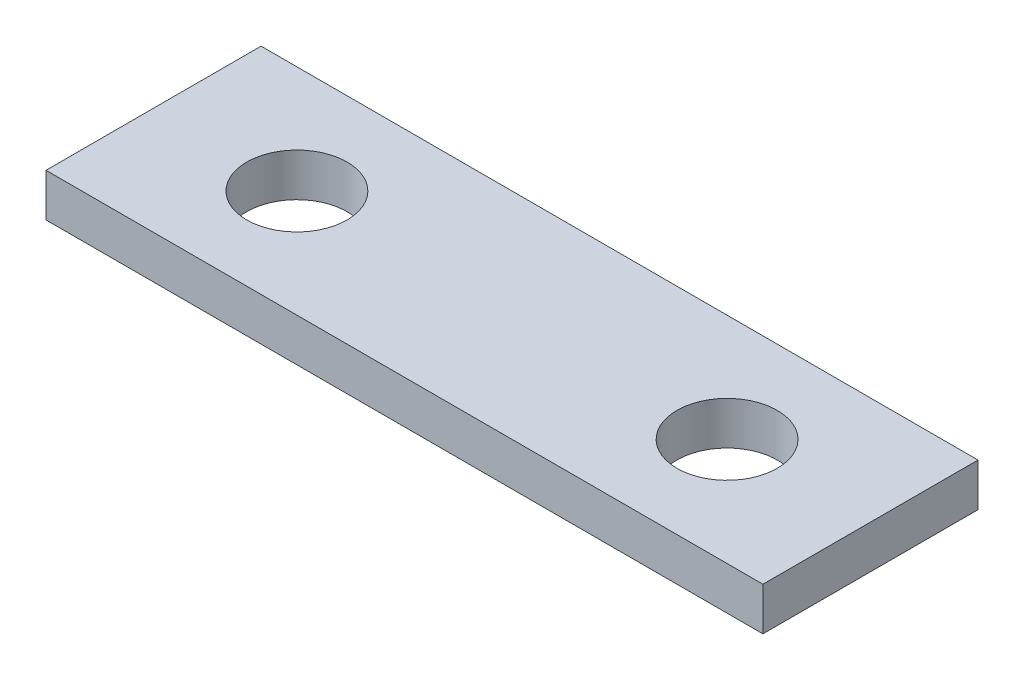
ISO-10303-21;
HEADER;
FILE_DESCRIPTION(('STEP AP214'),'2;1');
FILE_NAME('part.step','',(''),(''),'','','');
FILE_SCHEMA(('AUTOMOTIVE_DESIGN { 1 0 10303 214 1 1 1 1 }'));
ENDSEC;
DATA;
#1=APPLICATION_CONTEXT('core data for automotive mechanical design processes');
#2=APPLICATION_PROTOCOL_DEFINITION('international standard','automotive_design',2000,#1);
#3=PRODUCT_CONTEXT('',#1,'mechanical');
#4=PRODUCT('Part','Part','',(#3));
#5=PRODUCT_RELATED_PRODUCT_CATEGORY('part','',(#4));
#6=PRODUCT_DEFINITION_FORMATION('','',#4);
#7=PRODUCT_DEFINITION_CONTEXT('part definition',#1,'design');
#8=PRODUCT_DEFINITION('design','',#6,#7);
#9=PRODUCT_DEFINITION_SHAPE('','',#8);
#10=(LENGTH_UNIT() NAMED_UNIT(*) SI_UNIT(.MILLI.,.METRE.));
#11=(NAMED_UNIT(*) PLANE_ANGLE_UNIT() SI_UNIT($,.RADIAN.));
#12=(NAMED_UNIT(*) SI_UNIT($,.STERADIAN.) SOLID_ANGLE_UNIT());
#13=UNCERTAINTY_MEASURE_WITH_UNIT(LENGTH_MEASURE(1.E-05),#10,'distance_accuracy_value','');
#14=(GEOMETRIC_REPRESENTATION_CONTEXT(3) GLOBAL_UNCERTAINTY_ASSIGNED_CONTEXT((#13)) GLOBAL_UNIT_ASSIGNED_CONTEXT((#10,
#11,#12)) REPRESENTATION_CONTEXT('',''));
#15=CARTESIAN_POINT('',(0.,0.,0.));
#16=DIRECTION('',(0.,0.,1.));
#17=DIRECTION('',(1.,0.,0.));
#18=AXIS2_PLACEMENT_3D('',#15,#16,#17);
#19=CARTESIAN_POINT('',(0.,6.,0.));
#20=DIRECTION('',(0.,-1.,0.));
#21=DIRECTION('',(0.,0.,-1.));
#22=AXIS2_PLACEMENT_3D('',#19,#20,#21);
#23=PLANE('',#22);
#24=CARTESIAN_POINT('',(20.,6.,-14.9999999999999));
#25=DIRECTION('',(0.,1.,0.));
#26=DIRECTION('',(0.,0.,1.));
#27=AXIS2_PLACEMENT_3D('',#24,#25,#26);
#28=CIRCLE('',#27,7.);
#29=CARTESIAN_POINT('',(20.,6.,-7.9999999999999));
#30=VERTEX_POINT('',#29);
#31=EDGE_CURVE('E99',#30,#30,#28,.T.);
#32=ORIENTED_EDGE('',*,*,#31,.F.);
#33=EDGE_LOOP('',(#32));
#34=FACE_BOUND('',#33,.T.);
#35=DIRECTION('',(0.,0.,1.));
#36=VECTOR('',#35,1.);
#37=CARTESIAN_POINT('',(0.,6.,0.));
#38=LINE('',#37,#36);
#39=CARTESIAN_POINT('',(0.,6.,-30.));
#40=VERTEX_POINT('',#39);
#41=CARTESIAN_POINT('',(0.,6.,0.));
#42=VERTEX_POINT('',#41);
#43=EDGE_CURVE('E84',#40,#42,#38,.T.);
#44=ORIENTED_EDGE('',*,*,#43,.T.);
#45=DIRECTION('',(1.,0.,0.));
#46=VECTOR('',#45,1.);
#47=CARTESIAN_POINT('',(0.,6.,0.));
#48=LINE('',#47,#46);
#49=CARTESIAN_POINT('',(100.,6.,0.));
#50=VERTEX_POINT('',#49);
#51=EDGE_CURVE('E79',#42,#50,#48,.T.);
#52=ORIENTED_EDGE('',*,*,#51,.T.);
#53=DIRECTION('',(0.,0.,-1.));
#54=VECTOR('',#53,1.);
#55=CARTESIAN_POINT('',(100.,6.,0.));
#56=LINE('',#55,#54);
#57=CARTESIAN_POINT('',(100.,6.,-30.));
#58=VERTEX_POINT('',#57);
#59=EDGE_CURVE('E82',#50,#58,#56,.T.);
#60=ORIENTED_EDGE('',*,*,#59,.T.);
#61=DIRECTION('',(-1.,0.,0.));
#62=VECTOR('',#61,1.);
#63=CARTESIAN_POINT('',(0.,6.,-30.));
#64=LINE('',#63,#62);
#65=EDGE_CURVE('E49',#58,#40,#64,.T.);
#66=ORIENTED_EDGE('',*,*,#65,.T.);
#67=EDGE_LOOP('',(#44,#52,#60,#66));
#68=FACE_BOUND('',#67,.T.);
#69=CARTESIAN_POINT('',(80.,6.,-14.9999999999999));
#70=DIRECTION('',(0.,1.,0.));
#71=DIRECTION('',(0.,0.,1.));
#72=AXIS2_PLACEMENT_3D('',#69,#70,#71);
#73=CIRCLE('',#72,7.);
#74=CARTESIAN_POINT('',(80.,6.,-7.9999999999999));
#75=VERTEX_POINT('',#74);
#76=EDGE_CURVE('E114',#75,#75,#73,.T.);
#77=ORIENTED_EDGE('',*,*,#76,.F.);
#78=EDGE_LOOP('',(#77));
#79=FACE_BOUND('',#78,.T.);
#80=ADVANCED_FACE('F32',(#34,#68,#79),#23,.F.);
#81=CARTESIAN_POINT('',(0.,0.,0.));
#82=DIRECTION('',(0.,-1.,0.));
#83=DIRECTION('',(0.,0.,-1.));
#84=AXIS2_PLACEMENT_3D('',#81,#82,#83);
#85=PLANE('',#84);
#86=CARTESIAN_POINT('',(20.,0.,-14.9999999999999));
#87=DIRECTION('',(0.,1.,0.));
#88=DIRECTION('',(0.,0.,1.));
#89=AXIS2_PLACEMENT_3D('',#86,#87,#88);
#90=CIRCLE('',#89,7.);
#91=CARTESIAN_POINT('',(20.,0.,-7.9999999999999));
#92=VERTEX_POINT('',#91);
#93=EDGE_CURVE('E111',#92,#92,#90,.T.);
#94=ORIENTED_EDGE('',*,*,#93,.T.);
#95=EDGE_LOOP('',(#94));
#96=FACE_BOUND('',#95,.T.);
#97=DIRECTION('',(0.,0.,1.));
#98=VECTOR('',#97,1.);
#99=CARTESIAN_POINT('',(0.,0.,0.));
#100=LINE('',#99,#98);
#101=CARTESIAN_POINT('',(0.,0.,-30.));
#102=VERTEX_POINT('',#101);
#103=CARTESIAN_POINT('',(0.,0.,0.));
#104=VERTEX_POINT('',#103);
#105=EDGE_CURVE('E96',#102,#104,#100,.T.);
#106=ORIENTED_EDGE('',*,*,#105,.F.);
#107=DIRECTION('',(-1.,0.,0.));
#108=VECTOR('',#107,1.);
#109=CARTESIAN_POINT('',(0.,0.,-30.));
#110=LINE('',#109,#108);
#111=CARTESIAN_POINT('',(100.,0.,-30.));
#112=VERTEX_POINT('',#111);
#113=EDGE_CURVE('E72',#112,#102,#110,.T.);
#114=ORIENTED_EDGE('',*,*,#113,.F.);
#115=DIRECTION('',(0.,0.,-1.));
#116=VECTOR('',#115,1.);
#117=CARTESIAN_POINT('',(100.,0.,0.));
#118=LINE('',#117,#116);
#119=CARTESIAN_POINT('',(100.,0.,0.));
#120=VERTEX_POINT('',#119);
#121=EDGE_CURVE('E66',#120,#112,#118,.T.);
#122=ORIENTED_EDGE('',*,*,#121,.F.);
#123=DIRECTION('',(1.,0.,0.));
#124=VECTOR('',#123,1.);
#125=CARTESIAN_POINT('',(0.,0.,0.));
#126=LINE('',#125,#124);
#127=EDGE_CURVE('E88',#104,#120,#126,.T.);
#128=ORIENTED_EDGE('',*,*,#127,.F.);
#129=EDGE_LOOP('',(#106,#114,#122,#128));
#130=FACE_BOUND('',#129,.T.);
#131=CARTESIAN_POINT('',(80.,0.,-14.9999999999999));
#132=DIRECTION('',(0.,1.,0.));
#133=DIRECTION('',(0.,0.,1.));
#134=AXIS2_PLACEMENT_3D('',#131,#132,#133);
#135=CIRCLE('',#134,7.);
#136=CARTESIAN_POINT('',(80.,0.,-7.9999999999999));
#137=VERTEX_POINT('',#136);
#138=EDGE_CURVE('E117',#137,#137,#135,.T.);
#139=ORIENTED_EDGE('',*,*,#138,.T.);
#140=EDGE_LOOP('',(#139));
#141=FACE_BOUND('',#140,.T.);
#142=ADVANCED_FACE('F107',(#96,#130,#141),#85,.T.);
#143=CARTESIAN_POINT('',(0.,6.,0.));
#144=DIRECTION('',(1.,0.,0.));
#145=DIRECTION('',(0.,0.,-1.));
#146=AXIS2_PLACEMENT_3D('',#143,#144,#145);
#147=PLANE('',#146);
#148=ORIENTED_EDGE('',*,*,#105,.T.);
#149=DIRECTION('',(0.,-1.,0.));
#150=VECTOR('',#149,1.);
#151=CARTESIAN_POINT('',(0.,6.,0.));
#152=LINE('',#151,#150);
#153=EDGE_CURVE('E11',#42,#104,#152,.T.);
#154=ORIENTED_EDGE('',*,*,#153,.F.);
#155=ORIENTED_EDGE('',*,*,#43,.F.);
#156=DIRECTION('',(0.,-1.,0.));
#157=VECTOR('',#156,1.);
#158=CARTESIAN_POINT('',(0.,6.,-30.));
#159=LINE('',#158,#157);
#160=EDGE_CURVE('E92',#40,#102,#159,.T.);
#161=ORIENTED_EDGE('',*,*,#160,.T.);
#162=EDGE_LOOP('',(#148,#154,#155,#161));
#163=FACE_BOUND('',#162,.T.);
#164=ADVANCED_FACE('F34',(#163),#147,.F.);
#165=CARTESIAN_POINT('',(0.,6.,0.));
#166=DIRECTION('',(0.,0.,-1.));
#167=DIRECTION('',(-1.,0.,0.));
#168=AXIS2_PLACEMENT_3D('',#165,#166,#167);
#169=PLANE('',#168);
#170=ORIENTED_EDGE('',*,*,#127,.T.);
#171=DIRECTION('',(0.,-1.,0.));
#172=VECTOR('',#171,1.);
#173=CARTESIAN_POINT('',(100.,6.,0.));
#174=LINE('',#173,#172);
#175=EDGE_CURVE('E41',#50,#120,#174,.T.);
#176=ORIENTED_EDGE('',*,*,#175,.F.);
#177=ORIENTED_EDGE('',*,*,#51,.F.);
#178=ORIENTED_EDGE('',*,*,#153,.T.);
#179=EDGE_LOOP('',(#170,#176,#177,#178));
#180=FACE_BOUND('',#179,.T.);
#181=ADVANCED_FACE('F87',(#180),#169,.F.);
#182=CARTESIAN_POINT('',(100.,6.,0.));
#183=DIRECTION('',(-1.,0.,0.));
#184=DIRECTION('',(0.,0.,1.));
#185=AXIS2_PLACEMENT_3D('',#182,#183,#184);
#186=PLANE('',#185);
#187=ORIENTED_EDGE('',*,*,#121,.T.);
#188=DIRECTION('',(0.,-1.,0.));
#189=VECTOR('',#188,1.);
#190=CARTESIAN_POINT('',(100.,6.,-30.));
#191=LINE('',#190,#189);
#192=EDGE_CURVE('E89',#58,#112,#191,.T.);
#193=ORIENTED_EDGE('',*,*,#192,.F.);
#194=ORIENTED_EDGE('',*,*,#59,.F.);
#195=ORIENTED_EDGE('',*,*,#175,.T.);
#196=EDGE_LOOP('',(#187,#193,#194,#195));
#197=FACE_BOUND('',#196,.T.);
#198=ADVANCED_FACE('F90',(#197),#186,.F.);
#199=CARTESIAN_POINT('',(0.,6.,-30.));
#200=DIRECTION('',(0.,0.,1.));
#201=DIRECTION('',(1.,0.,0.));
#202=AXIS2_PLACEMENT_3D('',#199,#200,#201);
#203=PLANE('',#202);
#204=ORIENTED_EDGE('',*,*,#113,.T.);
#205=ORIENTED_EDGE('',*,*,#160,.F.);
#206=ORIENTED_EDGE('',*,*,#65,.F.);
#207=ORIENTED_EDGE('',*,*,#192,.T.);
#208=EDGE_LOOP('',(#204,#205,#206,#207));
#209=FACE_BOUND('',#208,.T.);
#210=ADVANCED_FACE('F104',(#209),#203,.F.);
#211=CARTESIAN_POINT('',(20.,6.,-14.9999999999999));
#212=DIRECTION('',(0.,-1.,0.));
#213=DIRECTION('',(0.,0.,-1.));
#214=AXIS2_PLACEMENT_3D('',#211,#212,#213);
#215=CYLINDRICAL_SURFACE('',#214,7.);
#216=ORIENTED_EDGE('',*,*,#31,.T.);
#217=EDGE_LOOP('',(#216));
#218=FACE_BOUND('',#217,.T.);
#219=ORIENTED_EDGE('',*,*,#93,.F.);
#220=EDGE_LOOP('',(#219));
#221=FACE_BOUND('',#220,.T.);
#222=ADVANCED_FACE('F135',(#218,#221),#215,.F.);
#223=CARTESIAN_POINT('',(80.,6.,-14.9999999999999));
#224=DIRECTION('',(0.,-1.,0.));
#225=DIRECTION('',(0.,0.,-1.));
#226=AXIS2_PLACEMENT_3D('',#223,#224,#225);
#227=CYLINDRICAL_SURFACE('',#226,7.);
#228=ORIENTED_EDGE('',*,*,#76,.T.);
#229=EDGE_LOOP('',(#228));
#230=FACE_BOUND('',#229,.T.);
#231=ORIENTED_EDGE('',*,*,#138,.F.);
#232=EDGE_LOOP('',(#231));
#233=FACE_BOUND('',#232,.T.);
#234=ADVANCED_FACE('F123',(#230,#233),#227,.F.);
#235=CLOSED_SHELL('',(#80,#142,#164,#181,#198,#210,#222,#234));
#236=MANIFOLD_SOLID_BREP('B2',#235);
#237=ADVANCED_BREP_SHAPE_REPRESENTATION('',(#18,#236),#14);
#238=SHAPE_DEFINITION_REPRESENTATION(#9,#237);
ENDSEC;
END-ISO-10303-21;
